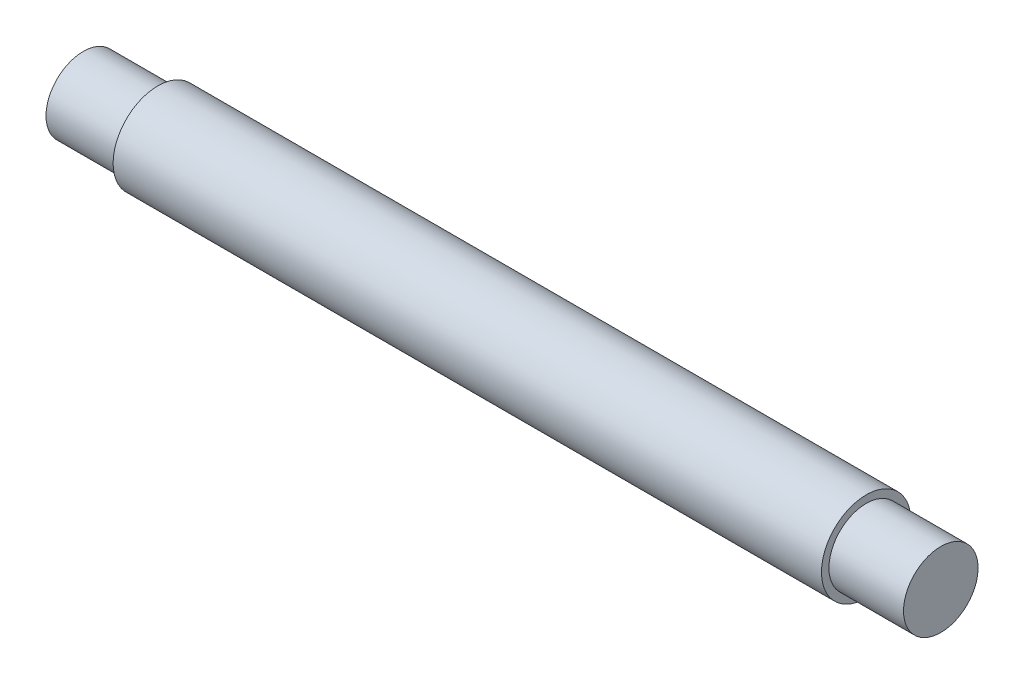
ISO-10303-21;
HEADER;
FILE_DESCRIPTION(('STEP AP214'),'2;1');
FILE_NAME('part.step','',(''),(''),'','','');
FILE_SCHEMA(('AUTOMOTIVE_DESIGN { 1 0 10303 214 1 1 1 1 }'));
ENDSEC;
DATA;
#1=APPLICATION_CONTEXT('core data for automotive mechanical design processes');
#2=APPLICATION_PROTOCOL_DEFINITION('international standard','automotive_design',2000,#1);
#3=PRODUCT_CONTEXT('',#1,'mechanical');
#4=PRODUCT('Part','Part','',(#3));
#5=PRODUCT_RELATED_PRODUCT_CATEGORY('part','',(#4));
#6=PRODUCT_DEFINITION_FORMATION('','',#4);
#7=PRODUCT_DEFINITION_CONTEXT('part definition',#1,'design');
#8=PRODUCT_DEFINITION('design','',#6,#7);
#9=PRODUCT_DEFINITION_SHAPE('','',#8);
#10=(LENGTH_UNIT() NAMED_UNIT(*) SI_UNIT(.MILLI.,.METRE.));
#11=(NAMED_UNIT(*) PLANE_ANGLE_UNIT() SI_UNIT($,.RADIAN.));
#12=(NAMED_UNIT(*) SI_UNIT($,.STERADIAN.) SOLID_ANGLE_UNIT());
#13=UNCERTAINTY_MEASURE_WITH_UNIT(LENGTH_MEASURE(1.E-05),#10,'distance_accuracy_value','');
#14=(GEOMETRIC_REPRESENTATION_CONTEXT(3) GLOBAL_UNCERTAINTY_ASSIGNED_CONTEXT((#13)) GLOBAL_UNIT_ASSIGNED_CONTEXT((#10,
#11,#12)) REPRESENTATION_CONTEXT('',''));
#15=CARTESIAN_POINT('',(0.,0.,0.));
#16=DIRECTION('',(0.,0.,1.));
#17=DIRECTION('',(1.,0.,0.));
#18=AXIS2_PLACEMENT_3D('',#15,#16,#17);
#19=CARTESIAN_POINT('',(115.,0.,0.));
#20=DIRECTION('',(-1.,0.,0.));
#21=DIRECTION('',(0.,0.,1.));
#22=AXIS2_PLACEMENT_3D('',#19,#20,#21);
#23=PLANE('',#22);
#24=CARTESIAN_POINT('',(115.,0.,0.));
#25=DIRECTION('',(-1.,0.,0.));
#26=DIRECTION('',(0.,0.,1.));
#27=AXIS2_PLACEMENT_3D('',#24,#25,#26);
#28=CIRCLE('',#27,5.);
#29=CARTESIAN_POINT('',(115.,0.,5.));
#30=VERTEX_POINT('',#29);
#31=EDGE_CURVE('E10',#30,#30,#28,.T.);
#32=ORIENTED_EDGE('',*,*,#31,.F.);
#33=EDGE_LOOP('',(#32));
#34=FACE_BOUND('',#33,.T.);
#35=ADVANCED_FACE('F44',(#34),#23,.F.);
#36=CARTESIAN_POINT('',(0.,0.,0.));
#37=DIRECTION('',(-1.,0.,0.));
#38=DIRECTION('',(0.,0.,1.));
#39=AXIS2_PLACEMENT_3D('',#36,#37,#38);
#40=CYLINDRICAL_SURFACE('',#39,5.);
#41=CARTESIAN_POINT('',(105.,0.,0.));
#42=DIRECTION('',(-1.,0.,0.));
#43=DIRECTION('',(0.,0.,1.));
#44=AXIS2_PLACEMENT_3D('',#41,#42,#43);
#45=CIRCLE('',#44,5.);
#46=CARTESIAN_POINT('',(105.,0.,5.));
#47=VERTEX_POINT('',#46);
#48=EDGE_CURVE('E51',#47,#47,#45,.T.);
#49=ORIENTED_EDGE('',*,*,#48,.F.);
#50=EDGE_LOOP('',(#49));
#51=FACE_BOUND('',#50,.T.);
#52=ORIENTED_EDGE('',*,*,#31,.T.);
#53=EDGE_LOOP('',(#52));
#54=FACE_BOUND('',#53,.T.);
#55=ADVANCED_FACE('F93',(#51,#54),#40,.T.);
#56=CARTESIAN_POINT('',(105.,0.,-5.));
#57=DIRECTION('',(-1.,0.,0.));
#58=DIRECTION('',(0.,0.,1.));
#59=AXIS2_PLACEMENT_3D('',#56,#57,#58);
#60=PLANE('',#59);
#61=CARTESIAN_POINT('',(105.,0.,0.));
#62=DIRECTION('',(-1.,0.,0.));
#63=DIRECTION('',(0.,0.,1.));
#64=AXIS2_PLACEMENT_3D('',#61,#62,#63);
#65=CIRCLE('',#64,6.);
#66=CARTESIAN_POINT('',(105.,0.,6.));
#67=VERTEX_POINT('',#66);
#68=EDGE_CURVE('E54',#67,#67,#65,.T.);
#69=ORIENTED_EDGE('',*,*,#68,.F.);
#70=EDGE_LOOP('',(#69));
#71=FACE_BOUND('',#70,.T.);
#72=ORIENTED_EDGE('',*,*,#48,.T.);
#73=EDGE_LOOP('',(#72));
#74=FACE_BOUND('',#73,.T.);
#75=ADVANCED_FACE('F88',(#71,#74),#60,.F.);
#76=CARTESIAN_POINT('',(0.,0.,0.));
#77=DIRECTION('',(-1.,0.,0.));
#78=DIRECTION('',(0.,0.,1.));
#79=AXIS2_PLACEMENT_3D('',#76,#77,#78);
#80=CYLINDRICAL_SURFACE('',#79,5.99999999999999);
#81=CARTESIAN_POINT('',(10.,0.,0.));
#82=DIRECTION('',(-1.,0.,0.));
#83=DIRECTION('',(0.,0.,1.));
#84=AXIS2_PLACEMENT_3D('',#81,#82,#83);
#85=CIRCLE('',#84,5.99999999999998);
#86=CARTESIAN_POINT('',(10.,0.,5.99999999999998));
#87=VERTEX_POINT('',#86);
#88=EDGE_CURVE('E56',#87,#87,#85,.T.);
#89=ORIENTED_EDGE('',*,*,#88,.F.);
#90=EDGE_LOOP('',(#89));
#91=FACE_BOUND('',#90,.T.);
#92=ORIENTED_EDGE('',*,*,#68,.T.);
#93=EDGE_LOOP('',(#92));
#94=FACE_BOUND('',#93,.T.);
#95=ADVANCED_FACE('F85',(#91,#94),#80,.T.);
#96=CARTESIAN_POINT('',(9.99999999999999,0.,-5.99999999999998));
#97=DIRECTION('',(1.,0.,0.));
#98=DIRECTION('',(0.,0.,-1.));
#99=AXIS2_PLACEMENT_3D('',#96,#97,#98);
#100=PLANE('',#99);
#101=CARTESIAN_POINT('',(9.99999999999999,0.,0.));
#102=DIRECTION('',(-1.,0.,0.));
#103=DIRECTION('',(0.,0.,1.));
#104=AXIS2_PLACEMENT_3D('',#101,#102,#103);
#105=CIRCLE('',#104,5.);
#106=CARTESIAN_POINT('',(9.99999999999999,0.,5.));
#107=VERTEX_POINT('',#106);
#108=EDGE_CURVE('E64',#107,#107,#105,.T.);
#109=ORIENTED_EDGE('',*,*,#108,.F.);
#110=EDGE_LOOP('',(#109));
#111=FACE_BOUND('',#110,.T.);
#112=ORIENTED_EDGE('',*,*,#88,.T.);
#113=EDGE_LOOP('',(#112));
#114=FACE_BOUND('',#113,.T.);
#115=ADVANCED_FACE('F78',(#111,#114),#100,.F.);
#116=CARTESIAN_POINT('',(0.,0.,0.));
#117=DIRECTION('',(-1.,0.,0.));
#118=DIRECTION('',(0.,0.,1.));
#119=AXIS2_PLACEMENT_3D('',#116,#117,#118);
#120=CYLINDRICAL_SURFACE('',#119,5.);
#121=CARTESIAN_POINT('',(0.,0.,0.));
#122=DIRECTION('',(-1.,0.,0.));
#123=DIRECTION('',(0.,0.,1.));
#124=AXIS2_PLACEMENT_3D('',#121,#122,#123);
#125=CIRCLE('',#124,5.);
#126=CARTESIAN_POINT('',(0.,0.,5.));
#127=VERTEX_POINT('',#126);
#128=EDGE_CURVE('E70',#127,#127,#125,.T.);
#129=ORIENTED_EDGE('',*,*,#128,.F.);
#130=EDGE_LOOP('',(#129));
#131=FACE_BOUND('',#130,.T.);
#132=ORIENTED_EDGE('',*,*,#108,.T.);
#133=EDGE_LOOP('',(#132));
#134=FACE_BOUND('',#133,.T.);
#135=ADVANCED_FACE('F73',(#131,#134),#120,.T.);
#136=CARTESIAN_POINT('',(0.,0.,-5.));
#137=DIRECTION('',(1.,0.,0.));
#138=DIRECTION('',(0.,0.,-1.));
#139=AXIS2_PLACEMENT_3D('',#136,#137,#138);
#140=PLANE('',#139);
#141=ORIENTED_EDGE('',*,*,#128,.T.);
#142=EDGE_LOOP('',(#141));
#143=FACE_BOUND('',#142,.T.);
#144=ADVANCED_FACE('F72',(#143),#140,.F.);
#145=CLOSED_SHELL('',(#35,#55,#75,#95,#115,#135,#144));
#146=MANIFOLD_SOLID_BREP('B2',#145);
#147=ADVANCED_BREP_SHAPE_REPRESENTATION('',(#18,#146),#14);
#148=SHAPE_DEFINITION_REPRESENTATION(#9,#147);
ENDSEC;
END-ISO-10303-21;
